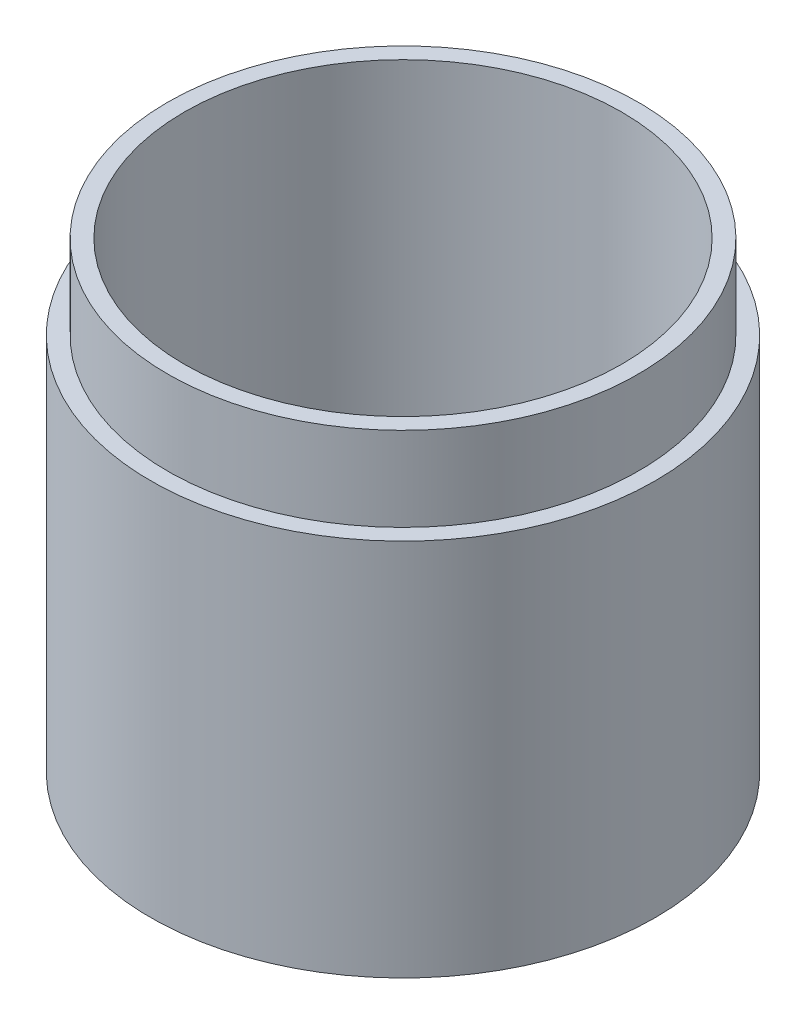
ISO-10303-21;
HEADER;
FILE_DESCRIPTION(('STEP AP214'),'2;1');
FILE_NAME('part.step','',(''),(''),'','','');
FILE_SCHEMA(('AUTOMOTIVE_DESIGN { 1 0 10303 214 1 1 1 1 }'));
ENDSEC;
DATA;
#1=APPLICATION_CONTEXT('core data for automotive mechanical design processes');
#2=APPLICATION_PROTOCOL_DEFINITION('international standard','automotive_design',2000,#1);
#3=PRODUCT_CONTEXT('',#1,'mechanical');
#4=PRODUCT('Part','Part','',(#3));
#5=PRODUCT_RELATED_PRODUCT_CATEGORY('part','',(#4));
#6=PRODUCT_DEFINITION_FORMATION('','',#4);
#7=PRODUCT_DEFINITION_CONTEXT('part definition',#1,'design');
#8=PRODUCT_DEFINITION('design','',#6,#7);
#9=PRODUCT_DEFINITION_SHAPE('','',#8);
#10=(LENGTH_UNIT() NAMED_UNIT(*) SI_UNIT(.MILLI.,.METRE.));
#11=(NAMED_UNIT(*) PLANE_ANGLE_UNIT() SI_UNIT($,.RADIAN.));
#12=(NAMED_UNIT(*) SI_UNIT($,.STERADIAN.) SOLID_ANGLE_UNIT());
#13=UNCERTAINTY_MEASURE_WITH_UNIT(LENGTH_MEASURE(1.E-05),#10,'distance_accuracy_value','');
#14=(GEOMETRIC_REPRESENTATION_CONTEXT(3) GLOBAL_UNCERTAINTY_ASSIGNED_CONTEXT((#13)) GLOBAL_UNIT_ASSIGNED_CONTEXT((#10,
#11,#12)) REPRESENTATION_CONTEXT('',''));
#15=CARTESIAN_POINT('',(0.,0.,0.));
#16=DIRECTION('',(0.,0.,1.));
#17=DIRECTION('',(1.,0.,0.));
#18=AXIS2_PLACEMENT_3D('',#15,#16,#17);
#19=CARTESIAN_POINT('',(0.,0.,0.));
#20=DIRECTION('',(0.,1.,0.));
#21=DIRECTION('',(-1.,0.,0.));
#22=AXIS2_PLACEMENT_3D('',#19,#20,#21);
#23=PLANE('',#22);
#24=CARTESIAN_POINT('',(0.,0.,0.));
#25=DIRECTION('',(0.,1.,0.));
#26=DIRECTION('',(-1.,0.,0.));
#27=AXIS2_PLACEMENT_3D('',#24,#25,#26);
#28=CIRCLE('',#27,38.1);
#29=CARTESIAN_POINT('',(-38.1,0.,0.));
#30=VERTEX_POINT('',#29);
#31=EDGE_CURVE('E10',#30,#30,#28,.T.);
#32=ORIENTED_EDGE('',*,*,#31,.F.);
#33=EDGE_LOOP('',(#32));
#34=FACE_BOUND('',#33,.T.);
#35=ADVANCED_FACE('F30',(#34),#23,.F.);
#36=CARTESIAN_POINT('',(0.,5.08,0.));
#37=DIRECTION('',(0.,1.,0.));
#38=DIRECTION('',(-1.,0.,0.));
#39=AXIS2_PLACEMENT_3D('',#36,#37,#38);
#40=CYLINDRICAL_SURFACE('',#39,38.1);
#41=CARTESIAN_POINT('',(0.,57.15,0.));
#42=DIRECTION('',(0.,1.,0.));
#43=DIRECTION('',(-1.,0.,0.));
#44=AXIS2_PLACEMENT_3D('',#41,#42,#43);
#45=CIRCLE('',#44,38.1);
#46=CARTESIAN_POINT('',(-38.1,57.15,0.));
#47=VERTEX_POINT('',#46);
#48=EDGE_CURVE('E36',#47,#47,#45,.T.);
#49=ORIENTED_EDGE('',*,*,#48,.F.);
#50=EDGE_LOOP('',(#49));
#51=FACE_BOUND('',#50,.T.);
#52=ORIENTED_EDGE('',*,*,#31,.T.);
#53=EDGE_LOOP('',(#52));
#54=FACE_BOUND('',#53,.T.);
#55=ADVANCED_FACE('F78',(#51,#54),#40,.T.);
#56=CARTESIAN_POINT('',(38.1,57.15,0.));
#57=DIRECTION('',(0.,-1.,0.));
#58=DIRECTION('',(1.,0.,0.));
#59=AXIS2_PLACEMENT_3D('',#56,#57,#58);
#60=PLANE('',#59);
#61=CARTESIAN_POINT('',(0.,57.15,0.));
#62=DIRECTION('',(0.,1.,0.));
#63=DIRECTION('',(-1.,0.,0.));
#64=AXIS2_PLACEMENT_3D('',#61,#62,#63);
#65=CIRCLE('',#64,35.56);
#66=CARTESIAN_POINT('',(-35.56,57.15,0.));
#67=VERTEX_POINT('',#66);
#68=EDGE_CURVE('E40',#67,#67,#65,.T.);
#69=ORIENTED_EDGE('',*,*,#68,.F.);
#70=EDGE_LOOP('',(#69));
#71=FACE_BOUND('',#70,.T.);
#72=ORIENTED_EDGE('',*,*,#48,.T.);
#73=EDGE_LOOP('',(#72));
#74=FACE_BOUND('',#73,.T.);
#75=ADVANCED_FACE('F73',(#71,#74),#60,.F.);
#76=CARTESIAN_POINT('',(0.,5.08,0.));
#77=DIRECTION('',(0.,1.,0.));
#78=DIRECTION('',(-1.,0.,0.));
#79=AXIS2_PLACEMENT_3D('',#76,#77,#78);
#80=CYLINDRICAL_SURFACE('',#79,35.56);
#81=CARTESIAN_POINT('',(0.,69.85,0.));
#82=DIRECTION('',(0.,1.,0.));
#83=DIRECTION('',(-1.,0.,0.));
#84=AXIS2_PLACEMENT_3D('',#81,#82,#83);
#85=CIRCLE('',#84,35.56);
#86=CARTESIAN_POINT('',(-35.56,69.85,0.));
#87=VERTEX_POINT('',#86);
#88=EDGE_CURVE('E44',#87,#87,#85,.T.);
#89=ORIENTED_EDGE('',*,*,#88,.F.);
#90=EDGE_LOOP('',(#89));
#91=FACE_BOUND('',#90,.T.);
#92=ORIENTED_EDGE('',*,*,#68,.T.);
#93=EDGE_LOOP('',(#92));
#94=FACE_BOUND('',#93,.T.);
#95=ADVANCED_FACE('F67',(#91,#94),#80,.T.);
#96=CARTESIAN_POINT('',(35.56,69.85,0.));
#97=DIRECTION('',(0.,-1.,0.));
#98=DIRECTION('',(1.,0.,0.));
#99=AXIS2_PLACEMENT_3D('',#96,#97,#98);
#100=PLANE('',#99);
#101=CARTESIAN_POINT('',(0.,69.85,0.));
#102=DIRECTION('',(0.,1.,0.));
#103=DIRECTION('',(-1.,0.,0.));
#104=AXIS2_PLACEMENT_3D('',#101,#102,#103);
#105=CIRCLE('',#104,33.02);
#106=CARTESIAN_POINT('',(-33.02,69.85,0.));
#107=VERTEX_POINT('',#106);
#108=EDGE_CURVE('E49',#107,#107,#105,.T.);
#109=ORIENTED_EDGE('',*,*,#108,.F.);
#110=EDGE_LOOP('',(#109));
#111=FACE_BOUND('',#110,.T.);
#112=ORIENTED_EDGE('',*,*,#88,.T.);
#113=EDGE_LOOP('',(#112));
#114=FACE_BOUND('',#113,.T.);
#115=ADVANCED_FACE('F61',(#111,#114),#100,.F.);
#116=CARTESIAN_POINT('',(0.,5.08,0.));
#117=DIRECTION('',(0.,1.,0.));
#118=DIRECTION('',(-1.,0.,0.));
#119=AXIS2_PLACEMENT_3D('',#116,#117,#118);
#120=CYLINDRICAL_SURFACE('',#119,33.02);
#121=CARTESIAN_POINT('',(0.,5.08,0.));
#122=DIRECTION('',(0.,1.,0.));
#123=DIRECTION('',(-1.,0.,0.));
#124=AXIS2_PLACEMENT_3D('',#121,#122,#123);
#125=CIRCLE('',#124,33.02);
#126=CARTESIAN_POINT('',(-33.02,5.08,0.));
#127=VERTEX_POINT('',#126);
#128=EDGE_CURVE('E52',#127,#127,#125,.T.);
#129=ORIENTED_EDGE('',*,*,#128,.F.);
#130=EDGE_LOOP('',(#129));
#131=FACE_BOUND('',#130,.T.);
#132=ORIENTED_EDGE('',*,*,#108,.T.);
#133=EDGE_LOOP('',(#132));
#134=FACE_BOUND('',#133,.T.);
#135=ADVANCED_FACE('F58',(#131,#134),#120,.F.);
#136=CARTESIAN_POINT('',(33.02,5.07999999999999,0.));
#137=DIRECTION('',(0.,-1.,0.));
#138=DIRECTION('',(1.,0.,0.));
#139=AXIS2_PLACEMENT_3D('',#136,#137,#138);
#140=PLANE('',#139);
#141=ORIENTED_EDGE('',*,*,#128,.T.);
#142=EDGE_LOOP('',(#141));
#143=FACE_BOUND('',#142,.T.);
#144=ADVANCED_FACE('F56',(#143),#140,.F.);
#145=CLOSED_SHELL('',(#35,#55,#75,#95,#115,#135,#144));
#146=MANIFOLD_SOLID_BREP('B2',#145);
#147=ADVANCED_BREP_SHAPE_REPRESENTATION('',(#18,#146),#14);
#148=SHAPE_DEFINITION_REPRESENTATION(#9,#147);
ENDSEC;
END-ISO-10303-21;
